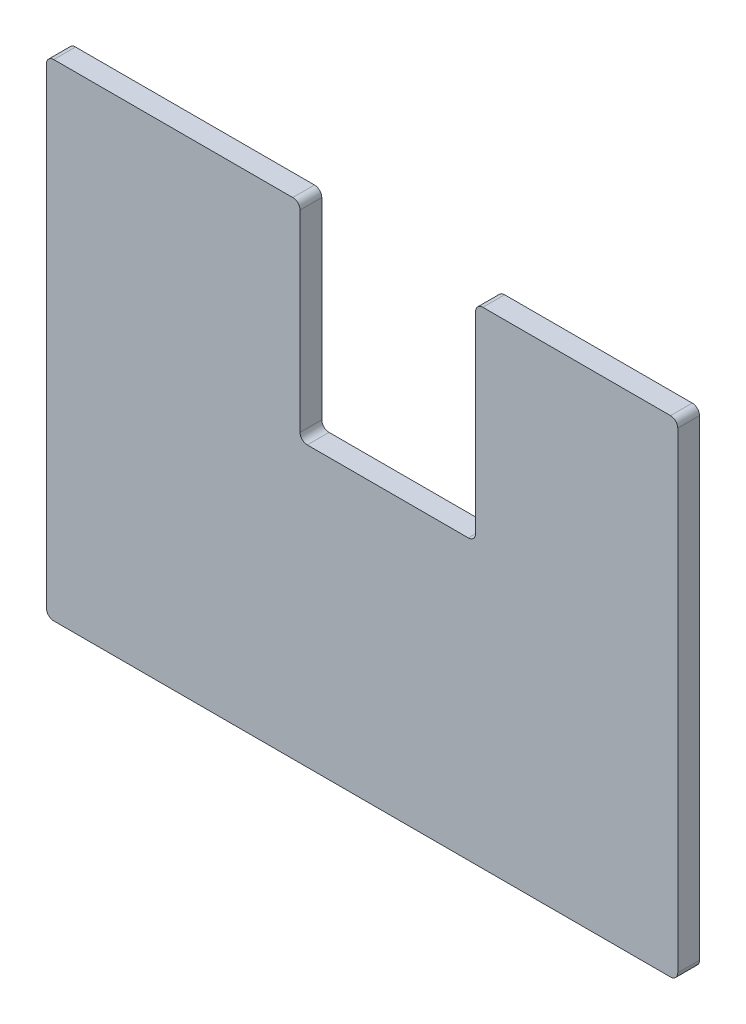
ISO-10303-21;
HEADER;
FILE_DESCRIPTION(('STEP AP214'),'2;1');
FILE_NAME('part.step','',(''),(''),'','','');
FILE_SCHEMA(('AUTOMOTIVE_DESIGN { 1 0 10303 214 1 1 1 1 }'));
ENDSEC;
DATA;
#1=APPLICATION_CONTEXT('core data for automotive mechanical design processes');
#2=APPLICATION_PROTOCOL_DEFINITION('international standard','automotive_design',2000,#1);
#3=PRODUCT_CONTEXT('',#1,'mechanical');
#4=PRODUCT('Part','Part','',(#3));
#5=PRODUCT_RELATED_PRODUCT_CATEGORY('part','',(#4));
#6=PRODUCT_DEFINITION_FORMATION('','',#4);
#7=PRODUCT_DEFINITION_CONTEXT('part definition',#1,'design');
#8=PRODUCT_DEFINITION('design','',#6,#7);
#9=PRODUCT_DEFINITION_SHAPE('','',#8);
#10=(LENGTH_UNIT() NAMED_UNIT(*) SI_UNIT(.MILLI.,.METRE.));
#11=(NAMED_UNIT(*) PLANE_ANGLE_UNIT() SI_UNIT($,.RADIAN.));
#12=(NAMED_UNIT(*) SI_UNIT($,.STERADIAN.) SOLID_ANGLE_UNIT());
#13=UNCERTAINTY_MEASURE_WITH_UNIT(LENGTH_MEASURE(1.E-05),#10,'distance_accuracy_value','');
#14=(GEOMETRIC_REPRESENTATION_CONTEXT(3) GLOBAL_UNCERTAINTY_ASSIGNED_CONTEXT((#13)) GLOBAL_UNIT_ASSIGNED_CONTEXT((#10,
#11,#12)) REPRESENTATION_CONTEXT('',''));
#15=CARTESIAN_POINT('',(0.,0.,0.));
#16=DIRECTION('',(0.,0.,1.));
#17=DIRECTION('',(1.,0.,0.));
#18=AXIS2_PLACEMENT_3D('',#15,#16,#17);
#19=CARTESIAN_POINT('',(43.6082489571433,33.509840054758,3.));
#20=DIRECTION('',(-1.,0.,0.));
#21=DIRECTION('',(0.,0.,1.));
#22=AXIS2_PLACEMENT_3D('',#19,#20,#21);
#23=PLANE('',#22);
#24=DIRECTION('',(0.,1.,0.));
#25=VECTOR('',#24,1.);
#26=CARTESIAN_POINT('',(43.6082489571433,33.509840054758,3.));
#27=LINE('',#26,#25);
#28=CARTESIAN_POINT('',(43.6082489571433,-32.566083295156,3.));
#29=VERTEX_POINT('',#28);
#30=CARTESIAN_POINT('',(43.6082489571433,32.509840054758,3.));
#31=VERTEX_POINT('',#30);
#32=EDGE_CURVE('E165',#29,#31,#27,.T.);
#33=ORIENTED_EDGE('',*,*,#32,.F.);
#34=DIRECTION('',(0.,0.,-1.));
#35=VECTOR('',#34,1.);
#36=CARTESIAN_POINT('',(43.6082489571433,-32.566083295156,3.));
#37=LINE('',#36,#35);
#38=CARTESIAN_POINT('',(43.6082489571433,-32.566083295156,0.));
#39=VERTEX_POINT('',#38);
#40=EDGE_CURVE('E150',#29,#39,#37,.T.);
#41=ORIENTED_EDGE('',*,*,#40,.T.);
#42=DIRECTION('',(0.,1.,0.));
#43=VECTOR('',#42,1.);
#44=CARTESIAN_POINT('',(43.6082489571433,33.509840054758,0.));
#45=LINE('',#44,#43);
#46=CARTESIAN_POINT('',(43.6082489571433,32.509840054758,0.));
#47=VERTEX_POINT('',#46);
#48=EDGE_CURVE('E162',#39,#47,#45,.T.);
#49=ORIENTED_EDGE('',*,*,#48,.T.);
#50=DIRECTION('',(0.,0.,-1.));
#51=VECTOR('',#50,1.);
#52=CARTESIAN_POINT('',(43.6082489571433,32.509840054758,3.));
#53=LINE('',#52,#51);
#54=EDGE_CURVE('E167',#47,#31,#53,.F.);
#55=ORIENTED_EDGE('',*,*,#54,.T.);
#56=EDGE_LOOP('',(#33,#41,#49,#55));
#57=FACE_BOUND('',#56,.T.);
#58=ADVANCED_FACE('F32',(#57),#23,.F.);
#59=CARTESIAN_POINT('',(43.6082489571433,33.509840054758,3.));
#60=DIRECTION('',(0.,-1.,0.));
#61=DIRECTION('',(0.,0.,-1.));
#62=AXIS2_PLACEMENT_3D('',#59,#60,#61);
#63=PLANE('',#62);
#64=DIRECTION('',(-1.,0.,0.));
#65=VECTOR('',#64,1.);
#66=CARTESIAN_POINT('',(43.6082489571433,33.509840054758,0.));
#67=LINE('',#66,#65);
#68=CARTESIAN_POINT('',(42.6082489571433,33.509840054758,0.));
#69=VERTEX_POINT('',#68);
#70=CARTESIAN_POINT('',(16.7164092936248,33.509840054758,0.));
#71=VERTEX_POINT('',#70);
#72=EDGE_CURVE('E171',#69,#71,#67,.T.);
#73=ORIENTED_EDGE('',*,*,#72,.T.);
#74=DIRECTION('',(0.,0.,-1.));
#75=VECTOR('',#74,1.);
#76=CARTESIAN_POINT('',(16.7164092936248,33.509840054758,3.));
#77=LINE('',#76,#75);
#78=CARTESIAN_POINT('',(16.7164092936248,33.509840054758,3.));
#79=VERTEX_POINT('',#78);
#80=EDGE_CURVE('E245',#71,#79,#77,.F.);
#81=ORIENTED_EDGE('',*,*,#80,.T.);
#82=DIRECTION('',(-1.,0.,0.));
#83=VECTOR('',#82,1.);
#84=CARTESIAN_POINT('',(43.6082489571433,33.509840054758,3.));
#85=LINE('',#84,#83);
#86=CARTESIAN_POINT('',(42.6082489571433,33.509840054758,3.));
#87=VERTEX_POINT('',#86);
#88=EDGE_CURVE('E375',#87,#79,#85,.T.);
#89=ORIENTED_EDGE('',*,*,#88,.F.);
#90=DIRECTION('',(0.,0.,-1.));
#91=VECTOR('',#90,1.);
#92=CARTESIAN_POINT('',(42.6082489571433,33.509840054758,3.));
#93=LINE('',#92,#91);
#94=EDGE_CURVE('E242',#87,#69,#93,.T.);
#95=ORIENTED_EDGE('',*,*,#94,.T.);
#96=EDGE_LOOP('',(#73,#81,#89,#95));
#97=FACE_BOUND('',#96,.T.);
#98=ADVANCED_FACE('F310',(#97),#63,.F.);
#99=CARTESIAN_POINT('',(15.7164092936248,33.509840054758,3.));
#100=DIRECTION('',(1.,0.,0.));
#101=DIRECTION('',(0.,0.,-1.));
#102=AXIS2_PLACEMENT_3D('',#99,#100,#101);
#103=PLANE('',#102);
#104=DIRECTION('',(0.,-1.,0.));
#105=VECTOR('',#104,1.);
#106=CARTESIAN_POINT('',(15.7164092936248,33.509840054758,0.));
#107=LINE('',#106,#105);
#108=CARTESIAN_POINT('',(15.7164092936248,32.509840054758,0.));
#109=VERTEX_POINT('',#108);
#110=CARTESIAN_POINT('',(15.7164092936248,5.95357822178483,0.));
#111=VERTEX_POINT('',#110);
#112=EDGE_CURVE('E174',#109,#111,#107,.T.);
#113=ORIENTED_EDGE('',*,*,#112,.T.);
#114=DIRECTION('',(0.,0.,-1.));
#115=VECTOR('',#114,1.);
#116=CARTESIAN_POINT('',(15.7164092936248,5.95357822178483,3.));
#117=LINE('',#116,#115);
#118=CARTESIAN_POINT('',(15.7164092936248,5.95357822178483,3.));
#119=VERTEX_POINT('',#118);
#120=EDGE_CURVE('E240',#111,#119,#117,.F.);
#121=ORIENTED_EDGE('',*,*,#120,.T.);
#122=DIRECTION('',(0.,-1.,0.));
#123=VECTOR('',#122,1.);
#124=CARTESIAN_POINT('',(15.7164092936248,33.509840054758,3.));
#125=LINE('',#124,#123);
#126=CARTESIAN_POINT('',(15.7164092936248,32.509840054758,3.));
#127=VERTEX_POINT('',#126);
#128=EDGE_CURVE('E276',#127,#119,#125,.T.);
#129=ORIENTED_EDGE('',*,*,#128,.F.);
#130=DIRECTION('',(0.,0.,-1.));
#131=VECTOR('',#130,1.);
#132=CARTESIAN_POINT('',(15.7164092936248,32.509840054758,3.));
#133=LINE('',#132,#131);
#134=EDGE_CURVE('E237',#127,#109,#133,.T.);
#135=ORIENTED_EDGE('',*,*,#134,.T.);
#136=EDGE_LOOP('',(#113,#121,#129,#135));
#137=FACE_BOUND('',#136,.T.);
#138=ADVANCED_FACE('F315',(#137),#103,.F.);
#139=CARTESIAN_POINT('',(-8.50739043032583,4.95357822178483,3.));
#140=DIRECTION('',(0.,-1.,0.));
#141=DIRECTION('',(0.,0.,-1.));
#142=AXIS2_PLACEMENT_3D('',#139,#140,#141);
#143=PLANE('',#142);
#144=DIRECTION('',(-1.,0.,0.));
#145=VECTOR('',#144,1.);
#146=CARTESIAN_POINT('',(-8.50739043032583,4.95357822178483,3.));
#147=LINE('',#146,#145);
#148=CARTESIAN_POINT('',(14.7164092936248,4.95357822178483,3.));
#149=VERTEX_POINT('',#148);
#150=CARTESIAN_POINT('',(-7.50739043032583,4.95357822178483,3.));
#151=VERTEX_POINT('',#150);
#152=EDGE_CURVE('E268',#149,#151,#147,.T.);
#153=ORIENTED_EDGE('',*,*,#152,.F.);
#154=DIRECTION('',(0.,0.,-1.));
#155=VECTOR('',#154,1.);
#156=CARTESIAN_POINT('',(14.7164092936248,4.95357822178483,0.));
#157=LINE('',#156,#155);
#158=CARTESIAN_POINT('',(14.7164092936248,4.95357822178483,0.));
#159=VERTEX_POINT('',#158);
#160=EDGE_CURVE('E234',#149,#159,#157,.T.);
#161=ORIENTED_EDGE('',*,*,#160,.T.);
#162=DIRECTION('',(-1.,0.,0.));
#163=VECTOR('',#162,1.);
#164=CARTESIAN_POINT('',(-8.50739043032583,4.95357822178483,0.));
#165=LINE('',#164,#163);
#166=CARTESIAN_POINT('',(-7.50739043032583,4.95357822178483,0.));
#167=VERTEX_POINT('',#166);
#168=EDGE_CURVE('E182',#159,#167,#165,.T.);
#169=ORIENTED_EDGE('',*,*,#168,.T.);
#170=DIRECTION('',(0.,0.,-1.));
#171=VECTOR('',#170,1.);
#172=CARTESIAN_POINT('',(-7.50739043032583,4.95357822178483,3.));
#173=LINE('',#172,#171);
#174=EDGE_CURVE('E232',#167,#151,#173,.F.);
#175=ORIENTED_EDGE('',*,*,#174,.T.);
#176=EDGE_LOOP('',(#153,#161,#169,#175));
#177=FACE_BOUND('',#176,.T.);
#178=ADVANCED_FACE('F257',(#177),#143,.F.);
#179=CARTESIAN_POINT('',(-8.50739043032583,33.509840054758,3.));
#180=DIRECTION('',(-1.,0.,0.));
#181=DIRECTION('',(0.,0.,1.));
#182=AXIS2_PLACEMENT_3D('',#179,#180,#181);
#183=PLANE('',#182);
#184=DIRECTION('',(0.,1.,0.));
#185=VECTOR('',#184,1.);
#186=CARTESIAN_POINT('',(-8.50739043032583,33.509840054758,0.));
#187=LINE('',#186,#185);
#188=CARTESIAN_POINT('',(-8.50739043032583,5.95357822178483,0.));
#189=VERTEX_POINT('',#188);
#190=CARTESIAN_POINT('',(-8.50739043032583,32.509840054758,0.));
#191=VERTEX_POINT('',#190);
#192=EDGE_CURVE('E185',#189,#191,#187,.T.);
#193=ORIENTED_EDGE('',*,*,#192,.T.);
#194=DIRECTION('',(0.,0.,-1.));
#195=VECTOR('',#194,1.);
#196=CARTESIAN_POINT('',(-8.50739043032583,32.509840054758,3.));
#197=LINE('',#196,#195);
#198=CARTESIAN_POINT('',(-8.50739043032583,32.509840054758,3.));
#199=VERTEX_POINT('',#198);
#200=EDGE_CURVE('E230',#191,#199,#197,.F.);
#201=ORIENTED_EDGE('',*,*,#200,.T.);
#202=DIRECTION('',(0.,1.,0.));
#203=VECTOR('',#202,1.);
#204=CARTESIAN_POINT('',(-8.50739043032583,33.509840054758,3.));
#205=LINE('',#204,#203);
#206=CARTESIAN_POINT('',(-8.50739043032583,5.95357822178483,3.));
#207=VERTEX_POINT('',#206);
#208=EDGE_CURVE('E266',#207,#199,#205,.T.);
#209=ORIENTED_EDGE('',*,*,#208,.F.);
#210=DIRECTION('',(0.,0.,-1.));
#211=VECTOR('',#210,1.);
#212=CARTESIAN_POINT('',(-8.50739043032583,5.95357822178483,0.));
#213=LINE('',#212,#211);
#214=EDGE_CURVE('E227',#207,#189,#213,.T.);
#215=ORIENTED_EDGE('',*,*,#214,.T.);
#216=EDGE_LOOP('',(#193,#201,#209,#215));
#217=FACE_BOUND('',#216,.T.);
#218=ADVANCED_FACE('F270',(#217),#183,.F.);
#219=CARTESIAN_POINT('',(-8.50739043032583,33.509840054758,3.));
#220=DIRECTION('',(0.,-1.,0.));
#221=DIRECTION('',(0.,0.,-1.));
#222=AXIS2_PLACEMENT_3D('',#219,#220,#221);
#223=PLANE('',#222);
#224=DIRECTION('',(-1.,0.,0.));
#225=VECTOR('',#224,1.);
#226=CARTESIAN_POINT('',(-8.50739043032583,33.509840054758,0.));
#227=LINE('',#226,#225);
#228=CARTESIAN_POINT('',(-9.50739043032583,33.509840054758,0.));
#229=VERTEX_POINT('',#228);
#230=CARTESIAN_POINT('',(-42.485746942377,33.509840054758,0.));
#231=VERTEX_POINT('',#230);
#232=EDGE_CURVE('E188',#229,#231,#227,.T.);
#233=ORIENTED_EDGE('',*,*,#232,.T.);
#234=DIRECTION('',(0.,0.,-1.));
#235=VECTOR('',#234,1.);
#236=CARTESIAN_POINT('',(-42.485746942377,33.509840054758,3.));
#237=LINE('',#236,#235);
#238=CARTESIAN_POINT('',(-42.485746942377,33.509840054758,3.));
#239=VERTEX_POINT('',#238);
#240=EDGE_CURVE('E225',#231,#239,#237,.F.);
#241=ORIENTED_EDGE('',*,*,#240,.T.);
#242=DIRECTION('',(-1.,0.,0.));
#243=VECTOR('',#242,1.);
#244=CARTESIAN_POINT('',(-8.50739043032583,33.509840054758,3.));
#245=LINE('',#244,#243);
#246=CARTESIAN_POINT('',(-9.50739043032583,33.509840054758,3.));
#247=VERTEX_POINT('',#246);
#248=EDGE_CURVE('E272',#247,#239,#245,.T.);
#249=ORIENTED_EDGE('',*,*,#248,.F.);
#250=DIRECTION('',(0.,0.,-1.));
#251=VECTOR('',#250,1.);
#252=CARTESIAN_POINT('',(-9.50739043032583,33.509840054758,3.));
#253=LINE('',#252,#251);
#254=EDGE_CURVE('E222',#247,#229,#253,.T.);
#255=ORIENTED_EDGE('',*,*,#254,.T.);
#256=EDGE_LOOP('',(#233,#241,#249,#255));
#257=FACE_BOUND('',#256,.T.);
#258=ADVANCED_FACE('F294',(#257),#223,.F.);
#259=CARTESIAN_POINT('',(-43.485746942377,33.509840054758,3.));
#260=DIRECTION('',(1.,0.,0.));
#261=DIRECTION('',(0.,0.,-1.));
#262=AXIS2_PLACEMENT_3D('',#259,#260,#261);
#263=PLANE('',#262);
#264=DIRECTION('',(0.,-1.,0.));
#265=VECTOR('',#264,1.);
#266=CARTESIAN_POINT('',(-43.485746942377,33.509840054758,0.));
#267=LINE('',#266,#265);
#268=CARTESIAN_POINT('',(-43.485746942377,32.509840054758,0.));
#269=VERTEX_POINT('',#268);
#270=CARTESIAN_POINT('',(-43.485746942377,-32.566083295156,0.));
#271=VERTEX_POINT('',#270);
#272=EDGE_CURVE('E191',#269,#271,#267,.T.);
#273=ORIENTED_EDGE('',*,*,#272,.T.);
#274=DIRECTION('',(0.,0.,-1.));
#275=VECTOR('',#274,1.);
#276=CARTESIAN_POINT('',(-43.485746942377,-32.566083295156,3.));
#277=LINE('',#276,#275);
#278=CARTESIAN_POINT('',(-43.485746942377,-32.566083295156,3.));
#279=VERTEX_POINT('',#278);
#280=EDGE_CURVE('E47',#271,#279,#277,.F.);
#281=ORIENTED_EDGE('',*,*,#280,.T.);
#282=DIRECTION('',(0.,-1.,0.));
#283=VECTOR('',#282,1.);
#284=CARTESIAN_POINT('',(-43.485746942377,33.509840054758,3.));
#285=LINE('',#284,#283);
#286=CARTESIAN_POINT('',(-43.485746942377,32.509840054758,3.));
#287=VERTEX_POINT('',#286);
#288=EDGE_CURVE('E274',#287,#279,#285,.T.);
#289=ORIENTED_EDGE('',*,*,#288,.F.);
#290=DIRECTION('',(0.,0.,-1.));
#291=VECTOR('',#290,1.);
#292=CARTESIAN_POINT('',(-43.485746942377,32.509840054758,3.));
#293=LINE('',#292,#291);
#294=EDGE_CURVE('E218',#287,#269,#293,.T.);
#295=ORIENTED_EDGE('',*,*,#294,.T.);
#296=EDGE_LOOP('',(#273,#281,#289,#295));
#297=FACE_BOUND('',#296,.T.);
#298=ADVANCED_FACE('F287',(#297),#263,.F.);
#299=CARTESIAN_POINT('',(43.6082489571433,-33.5660832951559,3.));
#300=DIRECTION('',(0.,1.,0.));
#301=DIRECTION('',(0.,0.,1.));
#302=AXIS2_PLACEMENT_3D('',#299,#300,#301);
#303=PLANE('',#302);
#304=DIRECTION('',(1.,0.,0.));
#305=VECTOR('',#304,1.);
#306=CARTESIAN_POINT('',(43.6082489571433,-33.5660832951559,0.));
#307=LINE('',#306,#305);
#308=CARTESIAN_POINT('',(-42.485746942377,-33.5660832951559,0.));
#309=VERTEX_POINT('',#308);
#310=CARTESIAN_POINT('',(42.6082489571433,-33.5660832951559,0.));
#311=VERTEX_POINT('',#310);
#312=EDGE_CURVE('E193',#309,#311,#307,.T.);
#313=ORIENTED_EDGE('',*,*,#312,.T.);
#314=DIRECTION('',(0.,0.,-1.));
#315=VECTOR('',#314,1.);
#316=CARTESIAN_POINT('',(42.6082489571433,-33.5660832951559,3.));
#317=LINE('',#316,#315);
#318=CARTESIAN_POINT('',(42.6082489571433,-33.5660832951559,3.));
#319=VERTEX_POINT('',#318);
#320=EDGE_CURVE('E151',#311,#319,#317,.F.);
#321=ORIENTED_EDGE('',*,*,#320,.T.);
#322=DIRECTION('',(1.,0.,0.));
#323=VECTOR('',#322,1.);
#324=CARTESIAN_POINT('',(43.6082489571433,-33.5660832951559,3.));
#325=LINE('',#324,#323);
#326=CARTESIAN_POINT('',(-42.485746942377,-33.5660832951559,3.));
#327=VERTEX_POINT('',#326);
#328=EDGE_CURVE('E177',#327,#319,#325,.T.);
#329=ORIENTED_EDGE('',*,*,#328,.F.);
#330=DIRECTION('',(0.,0.,-1.));
#331=VECTOR('',#330,1.);
#332=CARTESIAN_POINT('',(-42.485746942377,-33.5660832951559,3.));
#333=LINE('',#332,#331);
#334=EDGE_CURVE('E156',#327,#309,#333,.T.);
#335=ORIENTED_EDGE('',*,*,#334,.T.);
#336=EDGE_LOOP('',(#313,#321,#329,#335));
#337=FACE_BOUND('',#336,.T.);
#338=ADVANCED_FACE('F283',(#337),#303,.F.);
#339=CARTESIAN_POINT('',(0.,0.,3.));
#340=DIRECTION('',(0.,0.,-1.));
#341=DIRECTION('',(-1.,0.,0.));
#342=AXIS2_PLACEMENT_3D('',#339,#340,#341);
#343=PLANE('',#342);
#344=ORIENTED_EDGE('',*,*,#328,.T.);
#345=CARTESIAN_POINT('',(42.6082489571433,-32.566083295156,3.));
#346=DIRECTION('',(0.,0.,-1.));
#347=DIRECTION('',(-1.,0.,0.));
#348=AXIS2_PLACEMENT_3D('',#345,#346,#347);
#349=CIRCLE('',#348,1.);
#350=EDGE_CURVE('E216',#319,#29,#349,.F.);
#351=ORIENTED_EDGE('',*,*,#350,.T.);
#352=ORIENTED_EDGE('',*,*,#32,.T.);
#353=CARTESIAN_POINT('',(42.6082489571433,32.509840054758,3.));
#354=DIRECTION('',(0.,0.,-1.));
#355=DIRECTION('',(-1.,0.,0.));
#356=AXIS2_PLACEMENT_3D('',#353,#354,#355);
#357=CIRCLE('',#356,1.);
#358=EDGE_CURVE('E207',#31,#87,#357,.F.);
#359=ORIENTED_EDGE('',*,*,#358,.T.);
#360=ORIENTED_EDGE('',*,*,#88,.T.);
#361=CARTESIAN_POINT('',(16.7164092936248,32.509840054758,3.));
#362=DIRECTION('',(0.,0.,-1.));
#363=DIRECTION('',(-1.,0.,0.));
#364=AXIS2_PLACEMENT_3D('',#361,#362,#363);
#365=CIRCLE('',#364,1.);
#366=EDGE_CURVE('E209',#79,#127,#365,.F.);
#367=ORIENTED_EDGE('',*,*,#366,.T.);
#368=ORIENTED_EDGE('',*,*,#128,.T.);
#369=CARTESIAN_POINT('',(14.7164092936248,5.95357822178483,3.));
#370=DIRECTION('',(0.,0.,-1.));
#371=DIRECTION('',(-1.,0.,0.));
#372=AXIS2_PLACEMENT_3D('',#369,#370,#371);
#373=CIRCLE('',#372,1.);
#374=EDGE_CURVE('E249',#119,#149,#373,.T.);
#375=ORIENTED_EDGE('',*,*,#374,.T.);
#376=ORIENTED_EDGE('',*,*,#152,.T.);
#377=CARTESIAN_POINT('',(-7.50739043032583,5.95357822178483,3.));
#378=DIRECTION('',(0.,0.,-1.));
#379=DIRECTION('',(-1.,0.,0.));
#380=AXIS2_PLACEMENT_3D('',#377,#378,#379);
#381=CIRCLE('',#380,1.);
#382=EDGE_CURVE('E11',#151,#207,#381,.T.);
#383=ORIENTED_EDGE('',*,*,#382,.T.);
#384=ORIENTED_EDGE('',*,*,#208,.T.);
#385=CARTESIAN_POINT('',(-9.50739043032583,32.509840054758,3.));
#386=DIRECTION('',(0.,0.,-1.));
#387=DIRECTION('',(-1.,0.,0.));
#388=AXIS2_PLACEMENT_3D('',#385,#386,#387);
#389=CIRCLE('',#388,1.);
#390=EDGE_CURVE('E211',#199,#247,#389,.F.);
#391=ORIENTED_EDGE('',*,*,#390,.T.);
#392=ORIENTED_EDGE('',*,*,#248,.T.);
#393=CARTESIAN_POINT('',(-42.485746942377,32.509840054758,3.));
#394=DIRECTION('',(0.,0.,-1.));
#395=DIRECTION('',(-1.,0.,0.));
#396=AXIS2_PLACEMENT_3D('',#393,#394,#395);
#397=CIRCLE('',#396,1.);
#398=EDGE_CURVE('E54',#239,#287,#397,.F.);
#399=ORIENTED_EDGE('',*,*,#398,.T.);
#400=ORIENTED_EDGE('',*,*,#288,.T.);
#401=CARTESIAN_POINT('',(-42.485746942377,-32.5660832951559,3.));
#402=DIRECTION('',(0.,0.,-1.));
#403=DIRECTION('',(-1.,0.,0.));
#404=AXIS2_PLACEMENT_3D('',#401,#402,#403);
#405=CIRCLE('',#404,1.);
#406=EDGE_CURVE('E214',#279,#327,#405,.F.);
#407=ORIENTED_EDGE('',*,*,#406,.T.);
#408=EDGE_LOOP('',(#344,#351,#352,#359,#360,#367,#368,#375,#376,#383,#384,#391,#392,#399,#400,#407));
#409=FACE_BOUND('',#408,.T.);
#410=ADVANCED_FACE('F265',(#409),#343,.F.);
#411=CARTESIAN_POINT('',(0.,0.,0.));
#412=DIRECTION('',(0.,0.,-1.));
#413=DIRECTION('',(-1.,0.,0.));
#414=AXIS2_PLACEMENT_3D('',#411,#412,#413);
#415=PLANE('',#414);
#416=ORIENTED_EDGE('',*,*,#48,.F.);
#417=CARTESIAN_POINT('',(42.6082489571433,-32.566083295156,0.));
#418=DIRECTION('',(0.,0.,-1.));
#419=DIRECTION('',(-1.,0.,0.));
#420=AXIS2_PLACEMENT_3D('',#417,#418,#419);
#421=CIRCLE('',#420,1.);
#422=EDGE_CURVE('E146',#39,#311,#421,.T.);
#423=ORIENTED_EDGE('',*,*,#422,.T.);
#424=ORIENTED_EDGE('',*,*,#312,.F.);
#425=CARTESIAN_POINT('',(-42.485746942377,-32.5660832951559,0.));
#426=DIRECTION('',(0.,0.,-1.));
#427=DIRECTION('',(-1.,0.,0.));
#428=AXIS2_PLACEMENT_3D('',#425,#426,#427);
#429=CIRCLE('',#428,1.);
#430=EDGE_CURVE('E157',#309,#271,#429,.T.);
#431=ORIENTED_EDGE('',*,*,#430,.T.);
#432=ORIENTED_EDGE('',*,*,#272,.F.);
#433=CARTESIAN_POINT('',(-42.485746942377,32.509840054758,0.));
#434=DIRECTION('',(0.,0.,-1.));
#435=DIRECTION('',(-1.,0.,0.));
#436=AXIS2_PLACEMENT_3D('',#433,#434,#435);
#437=CIRCLE('',#436,1.);
#438=EDGE_CURVE('E201',#269,#231,#437,.T.);
#439=ORIENTED_EDGE('',*,*,#438,.T.);
#440=ORIENTED_EDGE('',*,*,#232,.F.);
#441=CARTESIAN_POINT('',(-9.50739043032583,32.509840054758,0.));
#442=DIRECTION('',(0.,0.,-1.));
#443=DIRECTION('',(-1.,0.,0.));
#444=AXIS2_PLACEMENT_3D('',#441,#442,#443);
#445=CIRCLE('',#444,1.);
#446=EDGE_CURVE('E199',#229,#191,#445,.T.);
#447=ORIENTED_EDGE('',*,*,#446,.T.);
#448=ORIENTED_EDGE('',*,*,#192,.F.);
#449=CARTESIAN_POINT('',(-7.50739043032583,5.95357822178483,0.));
#450=DIRECTION('',(0.,0.,-1.));
#451=DIRECTION('',(-1.,0.,0.));
#452=AXIS2_PLACEMENT_3D('',#449,#450,#451);
#453=CIRCLE('',#452,1.);
#454=EDGE_CURVE('E40',#189,#167,#453,.F.);
#455=ORIENTED_EDGE('',*,*,#454,.T.);
#456=ORIENTED_EDGE('',*,*,#168,.F.);
#457=CARTESIAN_POINT('',(14.7164092936248,5.95357822178483,0.));
#458=DIRECTION('',(0.,0.,-1.));
#459=DIRECTION('',(-1.,0.,0.));
#460=AXIS2_PLACEMENT_3D('',#457,#458,#459);
#461=CIRCLE('',#460,1.);
#462=EDGE_CURVE('E247',#159,#111,#461,.F.);
#463=ORIENTED_EDGE('',*,*,#462,.T.);
#464=ORIENTED_EDGE('',*,*,#112,.F.);
#465=CARTESIAN_POINT('',(16.7164092936248,32.509840054758,0.));
#466=DIRECTION('',(0.,0.,-1.));
#467=DIRECTION('',(-1.,0.,0.));
#468=AXIS2_PLACEMENT_3D('',#465,#466,#467);
#469=CIRCLE('',#468,1.);
#470=EDGE_CURVE('E197',#109,#71,#469,.T.);
#471=ORIENTED_EDGE('',*,*,#470,.T.);
#472=ORIENTED_EDGE('',*,*,#72,.F.);
#473=CARTESIAN_POINT('',(42.6082489571433,32.509840054758,0.));
#474=DIRECTION('',(0.,0.,-1.));
#475=DIRECTION('',(-1.,0.,0.));
#476=AXIS2_PLACEMENT_3D('',#473,#474,#475);
#477=CIRCLE('',#476,1.);
#478=EDGE_CURVE('E166',#69,#47,#477,.T.);
#479=ORIENTED_EDGE('',*,*,#478,.T.);
#480=EDGE_LOOP('',(#416,#423,#424,#431,#432,#439,#440,#447,#448,#455,#456,#463,#464,#471,#472,#479));
#481=FACE_BOUND('',#480,.T.);
#482=ADVANCED_FACE('F169',(#481),#415,.T.);
#483=CARTESIAN_POINT('',(42.6082489571433,-32.566083295156,3.));
#484=DIRECTION('',(0.,0.,-1.));
#485=DIRECTION('',(-1.,0.,0.));
#486=AXIS2_PLACEMENT_3D('',#483,#484,#485);
#487=CYLINDRICAL_SURFACE('',#486,1.);
#488=ORIENTED_EDGE('',*,*,#350,.F.);
#489=ORIENTED_EDGE('',*,*,#320,.F.);
#490=ORIENTED_EDGE('',*,*,#422,.F.);
#491=ORIENTED_EDGE('',*,*,#40,.F.);
#492=EDGE_LOOP('',(#488,#489,#490,#491));
#493=FACE_BOUND('',#492,.T.);
#494=ADVANCED_FACE('F149',(#493),#487,.T.);
#495=CARTESIAN_POINT('',(-42.485746942377,-32.5660832951559,3.));
#496=DIRECTION('',(0.,0.,-1.));
#497=DIRECTION('',(-1.,0.,0.));
#498=AXIS2_PLACEMENT_3D('',#495,#496,#497);
#499=CYLINDRICAL_SURFACE('',#498,1.);
#500=ORIENTED_EDGE('',*,*,#406,.F.);
#501=ORIENTED_EDGE('',*,*,#280,.F.);
#502=ORIENTED_EDGE('',*,*,#430,.F.);
#503=ORIENTED_EDGE('',*,*,#334,.F.);
#504=EDGE_LOOP('',(#500,#501,#502,#503));
#505=FACE_BOUND('',#504,.T.);
#506=ADVANCED_FACE('F285',(#505),#499,.T.);
#507=CARTESIAN_POINT('',(-42.485746942377,32.509840054758,3.));
#508=DIRECTION('',(0.,0.,-1.));
#509=DIRECTION('',(-1.,0.,0.));
#510=AXIS2_PLACEMENT_3D('',#507,#508,#509);
#511=CYLINDRICAL_SURFACE('',#510,1.);
#512=ORIENTED_EDGE('',*,*,#398,.F.);
#513=ORIENTED_EDGE('',*,*,#240,.F.);
#514=ORIENTED_EDGE('',*,*,#438,.F.);
#515=ORIENTED_EDGE('',*,*,#294,.F.);
#516=EDGE_LOOP('',(#512,#513,#514,#515));
#517=FACE_BOUND('',#516,.T.);
#518=ADVANCED_FACE('F290',(#517),#511,.T.);
#519=CARTESIAN_POINT('',(-9.50739043032583,32.509840054758,3.));
#520=DIRECTION('',(0.,0.,-1.));
#521=DIRECTION('',(-1.,0.,0.));
#522=AXIS2_PLACEMENT_3D('',#519,#520,#521);
#523=CYLINDRICAL_SURFACE('',#522,1.);
#524=ORIENTED_EDGE('',*,*,#390,.F.);
#525=ORIENTED_EDGE('',*,*,#200,.F.);
#526=ORIENTED_EDGE('',*,*,#446,.F.);
#527=ORIENTED_EDGE('',*,*,#254,.F.);
#528=EDGE_LOOP('',(#524,#525,#526,#527));
#529=FACE_BOUND('',#528,.T.);
#530=ADVANCED_FACE('F298',(#529),#523,.T.);
#531=CARTESIAN_POINT('',(14.7164092936248,5.95357822178483,3.));
#532=DIRECTION('',(0.,0.,1.));
#533=DIRECTION('',(1.,0.,0.));
#534=AXIS2_PLACEMENT_3D('',#531,#532,#533);
#535=CYLINDRICAL_SURFACE('',#534,1.);
#536=ORIENTED_EDGE('',*,*,#374,.F.);
#537=ORIENTED_EDGE('',*,*,#120,.F.);
#538=ORIENTED_EDGE('',*,*,#462,.F.);
#539=ORIENTED_EDGE('',*,*,#160,.F.);
#540=EDGE_LOOP('',(#536,#537,#538,#539));
#541=FACE_BOUND('',#540,.T.);
#542=ADVANCED_FACE('F300',(#541),#535,.F.);
#543=CARTESIAN_POINT('',(-7.50739043032583,5.95357822178483,3.));
#544=DIRECTION('',(0.,0.,1.));
#545=DIRECTION('',(1.,0.,0.));
#546=AXIS2_PLACEMENT_3D('',#543,#544,#545);
#547=CYLINDRICAL_SURFACE('',#546,1.);
#548=ORIENTED_EDGE('',*,*,#382,.F.);
#549=ORIENTED_EDGE('',*,*,#174,.F.);
#550=ORIENTED_EDGE('',*,*,#454,.F.);
#551=ORIENTED_EDGE('',*,*,#214,.F.);
#552=EDGE_LOOP('',(#548,#549,#550,#551));
#553=FACE_BOUND('',#552,.T.);
#554=ADVANCED_FACE('F261',(#553),#547,.F.);
#555=CARTESIAN_POINT('',(16.7164092936248,32.509840054758,3.));
#556=DIRECTION('',(0.,0.,-1.));
#557=DIRECTION('',(-1.,0.,0.));
#558=AXIS2_PLACEMENT_3D('',#555,#556,#557);
#559=CYLINDRICAL_SURFACE('',#558,1.);
#560=ORIENTED_EDGE('',*,*,#366,.F.);
#561=ORIENTED_EDGE('',*,*,#80,.F.);
#562=ORIENTED_EDGE('',*,*,#470,.F.);
#563=ORIENTED_EDGE('',*,*,#134,.F.);
#564=EDGE_LOOP('',(#560,#561,#562,#563));
#565=FACE_BOUND('',#564,.T.);
#566=ADVANCED_FACE('F351',(#565),#559,.T.);
#567=CARTESIAN_POINT('',(42.6082489571433,32.509840054758,3.));
#568=DIRECTION('',(0.,0.,-1.));
#569=DIRECTION('',(-1.,0.,0.));
#570=AXIS2_PLACEMENT_3D('',#567,#568,#569);
#571=CYLINDRICAL_SURFACE('',#570,1.);
#572=ORIENTED_EDGE('',*,*,#358,.F.);
#573=ORIENTED_EDGE('',*,*,#54,.F.);
#574=ORIENTED_EDGE('',*,*,#478,.F.);
#575=ORIENTED_EDGE('',*,*,#94,.F.);
#576=EDGE_LOOP('',(#572,#573,#574,#575));
#577=FACE_BOUND('',#576,.T.);
#578=ADVANCED_FACE('F34',(#577),#571,.T.);
#579=CLOSED_SHELL('',(#58,#98,#138,#178,#218,#258,#298,#338,#410,#482,#494,#506,#518,#530,#542,
#554,#566,#578));
#580=MANIFOLD_SOLID_BREP('B2',#579);
#581=ADVANCED_BREP_SHAPE_REPRESENTATION('',(#18,#580),#14);
#582=SHAPE_DEFINITION_REPRESENTATION(#9,#581);
ENDSEC;
END-ISO-10303-21;
